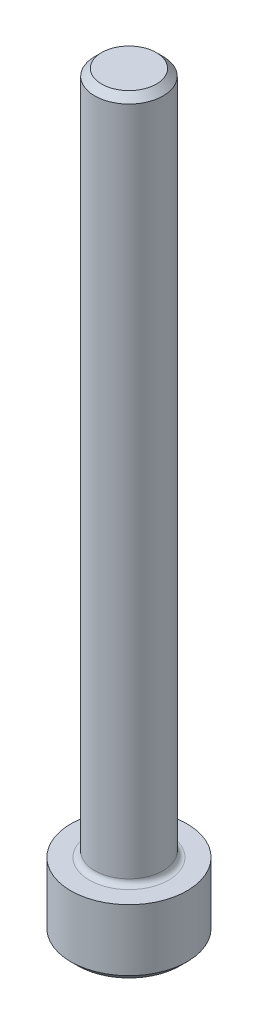
ISO-10303-21;
HEADER;
FILE_DESCRIPTION(('STEP AP214'),'2;1');
FILE_NAME('part.step','',(''),(''),'','','');
FILE_SCHEMA(('AUTOMOTIVE_DESIGN { 1 0 10303 214 1 1 1 1 }'));
ENDSEC;
DATA;
#1=APPLICATION_CONTEXT('core data for automotive mechanical design processes');
#2=APPLICATION_PROTOCOL_DEFINITION('international standard','automotive_design',2000,#1);
#3=PRODUCT_CONTEXT('',#1,'mechanical');
#4=PRODUCT('Part','Part','',(#3));
#5=PRODUCT_RELATED_PRODUCT_CATEGORY('part','',(#4));
#6=PRODUCT_DEFINITION_FORMATION('','',#4);
#7=PRODUCT_DEFINITION_CONTEXT('part definition',#1,'design');
#8=PRODUCT_DEFINITION('design','',#6,#7);
#9=PRODUCT_DEFINITION_SHAPE('','',#8);
#10=(LENGTH_UNIT() NAMED_UNIT(*) SI_UNIT(.MILLI.,.METRE.));
#11=(NAMED_UNIT(*) PLANE_ANGLE_UNIT() SI_UNIT($,.RADIAN.));
#12=(NAMED_UNIT(*) SI_UNIT($,.STERADIAN.) SOLID_ANGLE_UNIT());
#13=UNCERTAINTY_MEASURE_WITH_UNIT(LENGTH_MEASURE(1.E-05),#10,'distance_accuracy_value','');
#14=(GEOMETRIC_REPRESENTATION_CONTEXT(3) GLOBAL_UNCERTAINTY_ASSIGNED_CONTEXT((#13)) GLOBAL_UNIT_ASSIGNED_CONTEXT((#10,
#11,#12)) REPRESENTATION_CONTEXT('',''));
#15=CARTESIAN_POINT('',(0.,0.,0.));
#16=DIRECTION('',(0.,0.,1.));
#17=DIRECTION('',(1.,0.,0.));
#18=AXIS2_PLACEMENT_3D('',#15,#16,#17);
#19=CARTESIAN_POINT('',(0.,50.,0.));
#20=DIRECTION('',(0.,-1.,0.));
#21=DIRECTION('',(0.,0.,-1.));
#22=AXIS2_PLACEMENT_3D('',#19,#20,#21);
#23=CYLINDRICAL_SURFACE('',#22,2.5);
#24=CARTESIAN_POINT('',(0.,49.5,0.));
#25=DIRECTION('',(0.,1.,0.));
#26=DIRECTION('',(0.,0.,1.));
#27=AXIS2_PLACEMENT_3D('',#24,#25,#26);
#28=CIRCLE('',#27,2.5);
#29=CARTESIAN_POINT('',(0.,49.5,2.5));
#30=VERTEX_POINT('',#29);
#31=EDGE_CURVE('E11',#30,#30,#28,.F.);
#32=ORIENTED_EDGE('',*,*,#31,.T.);
#33=EDGE_LOOP('',(#32));
#34=FACE_BOUND('',#33,.T.);
#35=CARTESIAN_POINT('',(0.,0.399999999999998,0.));
#36=DIRECTION('',(0.,1.,0.));
#37=DIRECTION('',(0.,0.,1.));
#38=AXIS2_PLACEMENT_3D('',#35,#36,#37);
#39=CIRCLE('',#38,2.5);
#40=CARTESIAN_POINT('',(0.,0.399999999999998,2.5));
#41=VERTEX_POINT('',#40);
#42=EDGE_CURVE('E142',#41,#41,#39,.T.);
#43=ORIENTED_EDGE('',*,*,#42,.T.);
#44=EDGE_LOOP('',(#43));
#45=FACE_BOUND('',#44,.T.);
#46=ADVANCED_FACE('F32',(#34,#45),#23,.T.);
#47=CARTESIAN_POINT('',(0.,50.,0.));
#48=DIRECTION('',(0.,1.,0.));
#49=DIRECTION('',(0.,0.,1.));
#50=AXIS2_PLACEMENT_3D('',#47,#48,#49);
#51=PLANE('',#50);
#52=CARTESIAN_POINT('',(0.,50.,0.));
#53=DIRECTION('',(0.,1.,0.));
#54=DIRECTION('',(0.,0.,1.));
#55=AXIS2_PLACEMENT_3D('',#52,#53,#54);
#56=CIRCLE('',#55,1.99999999999999);
#57=CARTESIAN_POINT('',(0.,50.,1.99999999999999));
#58=VERTEX_POINT('',#57);
#59=EDGE_CURVE('E40',#58,#58,#56,.T.);
#60=ORIENTED_EDGE('',*,*,#59,.T.);
#61=EDGE_LOOP('',(#60));
#62=FACE_BOUND('',#61,.T.);
#63=ADVANCED_FACE('F156',(#62),#51,.T.);
#64=CARTESIAN_POINT('',(0.,-5.,0.));
#65=DIRECTION('',(0.,1.,0.));
#66=DIRECTION('',(0.,0.,1.));
#67=AXIS2_PLACEMENT_3D('',#64,#65,#66);
#68=CYLINDRICAL_SURFACE('',#67,4.25);
#69=CARTESIAN_POINT('',(0.,-4.50000000000001,0.));
#70=DIRECTION('',(0.,1.,0.));
#71=DIRECTION('',(0.,0.,1.));
#72=AXIS2_PLACEMENT_3D('',#69,#70,#71);
#73=CIRCLE('',#72,4.25);
#74=CARTESIAN_POINT('',(0.,-4.50000000000001,4.25));
#75=VERTEX_POINT('',#74);
#76=EDGE_CURVE('E148',#75,#75,#73,.T.);
#77=ORIENTED_EDGE('',*,*,#76,.T.);
#78=EDGE_LOOP('',(#77));
#79=FACE_BOUND('',#78,.T.);
#80=CARTESIAN_POINT('',(0.,0.,0.));
#81=DIRECTION('',(0.,1.,0.));
#82=DIRECTION('',(0.,0.,1.));
#83=AXIS2_PLACEMENT_3D('',#80,#81,#82);
#84=CIRCLE('',#83,4.25);
#85=CARTESIAN_POINT('',(0.,0.,4.25));
#86=VERTEX_POINT('',#85);
#87=EDGE_CURVE('E134',#86,#86,#84,.T.);
#88=ORIENTED_EDGE('',*,*,#87,.F.);
#89=EDGE_LOOP('',(#88));
#90=FACE_BOUND('',#89,.T.);
#91=ADVANCED_FACE('F177',(#79,#90),#68,.T.);
#92=CARTESIAN_POINT('',(0.,-5.,0.));
#93=DIRECTION('',(0.,1.,0.));
#94=DIRECTION('',(0.,0.,1.));
#95=AXIS2_PLACEMENT_3D('',#92,#93,#94);
#96=PLANE('',#95);
#97=DIRECTION('',(-0.866025403784439,0.,-0.5));
#98=VECTOR('',#97,1.);
#99=CARTESIAN_POINT('',(0.,-5.,2.3094010767585));
#100=LINE('',#99,#98);
#101=CARTESIAN_POINT('',(0.,-5.,2.3094010767585));
#102=VERTEX_POINT('',#101);
#103=CARTESIAN_POINT('',(-2.,-5.,1.15470053837925));
#104=VERTEX_POINT('',#103);
#105=EDGE_CURVE('E121',#102,#104,#100,.T.);
#106=ORIENTED_EDGE('',*,*,#105,.F.);
#107=DIRECTION('',(-0.866025403784439,0.,0.5));
#108=VECTOR('',#107,1.);
#109=CARTESIAN_POINT('',(2.,-5.,1.15470053837925));
#110=LINE('',#109,#108);
#111=CARTESIAN_POINT('',(2.,-5.,1.15470053837925));
#112=VERTEX_POINT('',#111);
#113=EDGE_CURVE('E47',#112,#102,#110,.T.);
#114=ORIENTED_EDGE('',*,*,#113,.F.);
#115=DIRECTION('',(0.,0.,1.));
#116=VECTOR('',#115,1.);
#117=CARTESIAN_POINT('',(2.,-5.,-1.15470053837925));
#118=LINE('',#117,#116);
#119=CARTESIAN_POINT('',(2.,-5.,-1.15470053837925));
#120=VERTEX_POINT('',#119);
#121=EDGE_CURVE('E130',#120,#112,#118,.T.);
#122=ORIENTED_EDGE('',*,*,#121,.F.);
#123=DIRECTION('',(0.866025403784439,0.,0.5));
#124=VECTOR('',#123,1.);
#125=CARTESIAN_POINT('',(0.,-5.,-2.3094010767585));
#126=LINE('',#125,#124);
#127=CARTESIAN_POINT('',(0.,-5.,-2.3094010767585));
#128=VERTEX_POINT('',#127);
#129=EDGE_CURVE('E128',#128,#120,#126,.T.);
#130=ORIENTED_EDGE('',*,*,#129,.F.);
#131=DIRECTION('',(0.866025403784439,0.,-0.5));
#132=VECTOR('',#131,1.);
#133=CARTESIAN_POINT('',(-2.,-5.,-1.15470053837925));
#134=LINE('',#133,#132);
#135=CARTESIAN_POINT('',(-2.,-5.,-1.15470053837925));
#136=VERTEX_POINT('',#135);
#137=EDGE_CURVE('E95',#136,#128,#134,.T.);
#138=ORIENTED_EDGE('',*,*,#137,.F.);
#139=DIRECTION('',(0.,0.,-1.));
#140=VECTOR('',#139,1.);
#141=CARTESIAN_POINT('',(-2.,-5.,1.15470053837925));
#142=LINE('',#141,#140);
#143=EDGE_CURVE('E124',#104,#136,#142,.T.);
#144=ORIENTED_EDGE('',*,*,#143,.F.);
#145=EDGE_LOOP('',(#106,#114,#122,#130,#138,#144));
#146=FACE_BOUND('',#145,.T.);
#147=CARTESIAN_POINT('',(0.,-5.,0.));
#148=DIRECTION('',(0.,1.,0.));
#149=DIRECTION('',(0.,0.,1.));
#150=AXIS2_PLACEMENT_3D('',#147,#148,#149);
#151=CIRCLE('',#150,3.75000000000001);
#152=CARTESIAN_POINT('',(0.,-5.,3.75000000000001));
#153=VERTEX_POINT('',#152);
#154=EDGE_CURVE('E151',#153,#153,#151,.F.);
#155=ORIENTED_EDGE('',*,*,#154,.T.);
#156=EDGE_LOOP('',(#155));
#157=FACE_BOUND('',#156,.T.);
#158=ADVANCED_FACE('F188',(#146,#157),#96,.F.);
#159=CARTESIAN_POINT('',(0.,0.,0.));
#160=DIRECTION('',(0.,1.,0.));
#161=DIRECTION('',(0.,0.,1.));
#162=AXIS2_PLACEMENT_3D('',#159,#160,#161);
#163=PLANE('',#162);
#164=CARTESIAN_POINT('',(0.,0.,0.));
#165=DIRECTION('',(0.,1.,0.));
#166=DIRECTION('',(0.,0.,1.));
#167=AXIS2_PLACEMENT_3D('',#164,#165,#166);
#168=CIRCLE('',#167,2.9);
#169=CARTESIAN_POINT('',(0.,0.,2.9));
#170=VERTEX_POINT('',#169);
#171=EDGE_CURVE('E145',#170,#170,#168,.F.);
#172=ORIENTED_EDGE('',*,*,#171,.T.);
#173=EDGE_LOOP('',(#172));
#174=FACE_BOUND('',#173,.T.);
#175=ORIENTED_EDGE('',*,*,#87,.T.);
#176=EDGE_LOOP('',(#175));
#177=FACE_BOUND('',#176,.T.);
#178=ADVANCED_FACE('F183',(#174,#177),#163,.T.);
#179=CARTESIAN_POINT('',(0.,0.399999999999998,0.));
#180=DIRECTION('',(0.,1.,0.));
#181=DIRECTION('',(0.,0.,1.));
#182=AXIS2_PLACEMENT_3D('',#179,#180,#181);
#183=TOROIDAL_SURFACE('',#182,2.9,0.4);
#184=ORIENTED_EDGE('',*,*,#171,.F.);
#185=EDGE_LOOP('',(#184));
#186=FACE_BOUND('',#185,.T.);
#187=ORIENTED_EDGE('',*,*,#42,.F.);
#188=EDGE_LOOP('',(#187));
#189=FACE_BOUND('',#188,.T.);
#190=ADVANCED_FACE('F168',(#186,#189),#183,.F.);
#191=CARTESIAN_POINT('',(0.,-4.50000000000001,0.));
#192=DIRECTION('',(0.,1.,0.));
#193=DIRECTION('',(0.,0.,1.));
#194=AXIS2_PLACEMENT_3D('',#191,#192,#193);
#195=CONICAL_SURFACE('',#194,4.25,0.785398163397449);
#196=ORIENTED_EDGE('',*,*,#154,.F.);
#197=EDGE_LOOP('',(#196));
#198=FACE_BOUND('',#197,.T.);
#199=ORIENTED_EDGE('',*,*,#76,.F.);
#200=EDGE_LOOP('',(#199));
#201=FACE_BOUND('',#200,.T.);
#202=ADVANCED_FACE('F160',(#198,#201),#195,.T.);
#203=CARTESIAN_POINT('',(0.,50.,0.));
#204=DIRECTION('',(0.,-1.,0.));
#205=DIRECTION('',(0.,0.,-1.));
#206=AXIS2_PLACEMENT_3D('',#203,#204,#205);
#207=CONICAL_SURFACE('',#206,1.99999999999999,0.785398163397447);
#208=ORIENTED_EDGE('',*,*,#31,.F.);
#209=EDGE_LOOP('',(#208));
#210=FACE_BOUND('',#209,.T.);
#211=ORIENTED_EDGE('',*,*,#59,.F.);
#212=EDGE_LOOP('',(#211));
#213=FACE_BOUND('',#212,.T.);
#214=ADVANCED_FACE('F34',(#210,#213),#207,.T.);
#215=CARTESIAN_POINT('',(2.,-2.5,1.15470053837925));
#216=DIRECTION('',(0.5,0.,0.866025403784439));
#217=DIRECTION('',(0.866025403784439,0.,-0.5));
#218=AXIS2_PLACEMENT_3D('',#215,#216,#217);
#219=PLANE('',#218);
#220=ORIENTED_EDGE('',*,*,#113,.T.);
#221=DIRECTION('',(0.,-1.,0.));
#222=VECTOR('',#221,1.);
#223=CARTESIAN_POINT('',(0.,-2.5,2.3094010767585));
#224=LINE('',#223,#222);
#225=CARTESIAN_POINT('',(0.,-2.5,2.3094010767585));
#226=VERTEX_POINT('',#225);
#227=EDGE_CURVE('E77',#226,#102,#224,.T.);
#228=ORIENTED_EDGE('',*,*,#227,.F.);
#229=DIRECTION('',(-0.866025403784439,0.,0.5));
#230=VECTOR('',#229,1.);
#231=CARTESIAN_POINT('',(2.,-2.5,1.15470053837925));
#232=LINE('',#231,#230);
#233=CARTESIAN_POINT('',(2.,-2.5,1.15470053837925));
#234=VERTEX_POINT('',#233);
#235=EDGE_CURVE('E132',#234,#226,#232,.T.);
#236=ORIENTED_EDGE('',*,*,#235,.F.);
#237=DIRECTION('',(0.,-1.,0.));
#238=VECTOR('',#237,1.);
#239=CARTESIAN_POINT('',(2.,-2.5,1.15470053837925));
#240=LINE('',#239,#238);
#241=EDGE_CURVE('E55',#234,#112,#240,.T.);
#242=ORIENTED_EDGE('',*,*,#241,.T.);
#243=EDGE_LOOP('',(#220,#228,#236,#242));
#244=FACE_BOUND('',#243,.T.);
#245=ADVANCED_FACE('F159',(#244),#219,.F.);
#246=CARTESIAN_POINT('',(2.,-2.5,-1.15470053837925));
#247=DIRECTION('',(1.,0.,0.));
#248=DIRECTION('',(0.,0.,-1.));
#249=AXIS2_PLACEMENT_3D('',#246,#247,#248);
#250=PLANE('',#249);
#251=ORIENTED_EDGE('',*,*,#121,.T.);
#252=ORIENTED_EDGE('',*,*,#241,.F.);
#253=DIRECTION('',(0.,0.,1.));
#254=VECTOR('',#253,1.);
#255=CARTESIAN_POINT('',(2.,-2.5,-1.15470053837925));
#256=LINE('',#255,#254);
#257=CARTESIAN_POINT('',(2.,-2.5,-1.15470053837925));
#258=VERTEX_POINT('',#257);
#259=EDGE_CURVE('E107',#258,#234,#256,.T.);
#260=ORIENTED_EDGE('',*,*,#259,.F.);
#261=DIRECTION('',(0.,-1.,0.));
#262=VECTOR('',#261,1.);
#263=CARTESIAN_POINT('',(2.,-2.5,-1.15470053837925));
#264=LINE('',#263,#262);
#265=EDGE_CURVE('E99',#258,#120,#264,.T.);
#266=ORIENTED_EDGE('',*,*,#265,.T.);
#267=EDGE_LOOP('',(#251,#252,#260,#266));
#268=FACE_BOUND('',#267,.T.);
#269=ADVANCED_FACE('F166',(#268),#250,.F.);
#270=CARTESIAN_POINT('',(0.,-2.5,-2.3094010767585));
#271=DIRECTION('',(0.5,0.,-0.866025403784439));
#272=DIRECTION('',(-0.866025403784439,0.,-0.5));
#273=AXIS2_PLACEMENT_3D('',#270,#271,#272);
#274=PLANE('',#273);
#275=ORIENTED_EDGE('',*,*,#129,.T.);
#276=ORIENTED_EDGE('',*,*,#265,.F.);
#277=DIRECTION('',(0.866025403784439,0.,0.5));
#278=VECTOR('',#277,1.);
#279=CARTESIAN_POINT('',(0.,-2.5,-2.3094010767585));
#280=LINE('',#279,#278);
#281=CARTESIAN_POINT('',(0.,-2.5,-2.3094010767585));
#282=VERTEX_POINT('',#281);
#283=EDGE_CURVE('E103',#282,#258,#280,.T.);
#284=ORIENTED_EDGE('',*,*,#283,.F.);
#285=DIRECTION('',(0.,-1.,0.));
#286=VECTOR('',#285,1.);
#287=CARTESIAN_POINT('',(0.,-2.5,-2.3094010767585));
#288=LINE('',#287,#286);
#289=EDGE_CURVE('E88',#282,#128,#288,.T.);
#290=ORIENTED_EDGE('',*,*,#289,.T.);
#291=EDGE_LOOP('',(#275,#276,#284,#290));
#292=FACE_BOUND('',#291,.T.);
#293=ADVANCED_FACE('F104',(#292),#274,.F.);
#294=CARTESIAN_POINT('',(-2.,-2.5,-1.15470053837925));
#295=DIRECTION('',(-0.5,0.,-0.866025403784439));
#296=DIRECTION('',(-0.866025403784439,0.,0.5));
#297=AXIS2_PLACEMENT_3D('',#294,#295,#296);
#298=PLANE('',#297);
#299=ORIENTED_EDGE('',*,*,#137,.T.);
#300=ORIENTED_EDGE('',*,*,#289,.F.);
#301=DIRECTION('',(0.866025403784439,0.,-0.5));
#302=VECTOR('',#301,1.);
#303=CARTESIAN_POINT('',(-2.,-2.5,-1.15470053837925));
#304=LINE('',#303,#302);
#305=CARTESIAN_POINT('',(-2.,-2.5,-1.15470053837925));
#306=VERTEX_POINT('',#305);
#307=EDGE_CURVE('E92',#306,#282,#304,.T.);
#308=ORIENTED_EDGE('',*,*,#307,.F.);
#309=DIRECTION('',(0.,-1.,0.));
#310=VECTOR('',#309,1.);
#311=CARTESIAN_POINT('',(-2.,-2.5,-1.15470053837925));
#312=LINE('',#311,#310);
#313=EDGE_CURVE('E100',#306,#136,#312,.T.);
#314=ORIENTED_EDGE('',*,*,#313,.T.);
#315=EDGE_LOOP('',(#299,#300,#308,#314));
#316=FACE_BOUND('',#315,.T.);
#317=ADVANCED_FACE('F90',(#316),#298,.F.);
#318=CARTESIAN_POINT('',(-2.,-2.5,1.15470053837925));
#319=DIRECTION('',(-1.,0.,0.));
#320=DIRECTION('',(0.,0.,1.));
#321=AXIS2_PLACEMENT_3D('',#318,#319,#320);
#322=PLANE('',#321);
#323=ORIENTED_EDGE('',*,*,#143,.T.);
#324=ORIENTED_EDGE('',*,*,#313,.F.);
#325=DIRECTION('',(0.,0.,-1.));
#326=VECTOR('',#325,1.);
#327=CARTESIAN_POINT('',(-2.,-2.5,1.15470053837925));
#328=LINE('',#327,#326);
#329=CARTESIAN_POINT('',(-2.,-2.5,1.15470053837925));
#330=VERTEX_POINT('',#329);
#331=EDGE_CURVE('E113',#330,#306,#328,.T.);
#332=ORIENTED_EDGE('',*,*,#331,.F.);
#333=DIRECTION('',(0.,-1.,0.));
#334=VECTOR('',#333,1.);
#335=CARTESIAN_POINT('',(-2.,-2.5,1.15470053837925));
#336=LINE('',#335,#334);
#337=EDGE_CURVE('E137',#330,#104,#336,.T.);
#338=ORIENTED_EDGE('',*,*,#337,.T.);
#339=EDGE_LOOP('',(#323,#324,#332,#338));
#340=FACE_BOUND('',#339,.T.);
#341=ADVANCED_FACE('F208',(#340),#322,.F.);
#342=CARTESIAN_POINT('',(0.,-2.5,2.3094010767585));
#343=DIRECTION('',(-0.5,0.,0.866025403784439));
#344=DIRECTION('',(0.866025403784439,0.,0.5));
#345=AXIS2_PLACEMENT_3D('',#342,#343,#344);
#346=PLANE('',#345);
#347=ORIENTED_EDGE('',*,*,#105,.T.);
#348=ORIENTED_EDGE('',*,*,#337,.F.);
#349=DIRECTION('',(-0.866025403784439,0.,-0.5));
#350=VECTOR('',#349,1.);
#351=CARTESIAN_POINT('',(0.,-2.5,2.3094010767585));
#352=LINE('',#351,#350);
#353=EDGE_CURVE('E115',#226,#330,#352,.T.);
#354=ORIENTED_EDGE('',*,*,#353,.F.);
#355=ORIENTED_EDGE('',*,*,#227,.T.);
#356=EDGE_LOOP('',(#347,#348,#354,#355));
#357=FACE_BOUND('',#356,.T.);
#358=ADVANCED_FACE('F205',(#357),#346,.F.);
#359=CARTESIAN_POINT('',(0.,-2.5,0.));
#360=DIRECTION('',(0.,-1.,0.));
#361=DIRECTION('',(0.,0.,-1.));
#362=AXIS2_PLACEMENT_3D('',#359,#360,#361);
#363=PLANE('',#362);
#364=ORIENTED_EDGE('',*,*,#235,.T.);
#365=ORIENTED_EDGE('',*,*,#353,.T.);
#366=ORIENTED_EDGE('',*,*,#331,.T.);
#367=ORIENTED_EDGE('',*,*,#307,.T.);
#368=ORIENTED_EDGE('',*,*,#283,.T.);
#369=ORIENTED_EDGE('',*,*,#259,.T.);
#370=EDGE_LOOP('',(#364,#365,#366,#367,#368,#369));
#371=FACE_BOUND('',#370,.T.);
#372=ADVANCED_FACE('F110',(#371),#363,.T.);
#373=CLOSED_SHELL('',(#46,#63,#91,#158,#178,#190,#202,#214,#245,#269,#293,#317,#341,#358,#372));
#374=MANIFOLD_SOLID_BREP('B2',#373);
#375=ADVANCED_BREP_SHAPE_REPRESENTATION('',(#18,#374),#14);
#376=SHAPE_DEFINITION_REPRESENTATION(#9,#375);
ENDSEC;
END-ISO-10303-21;
